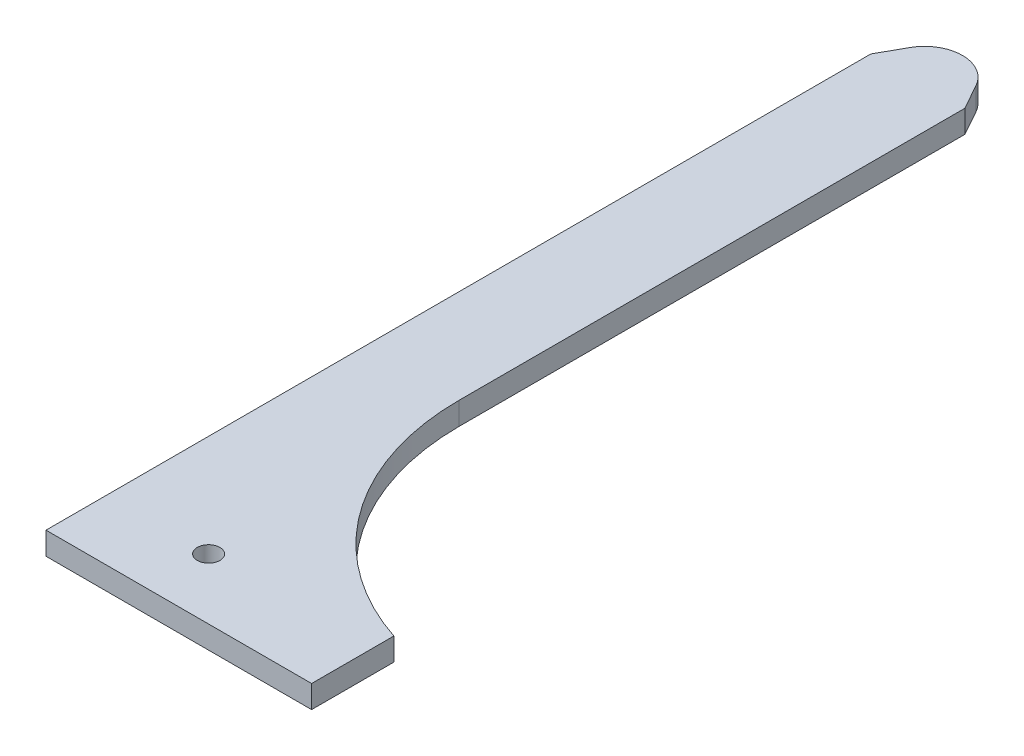
ISO-10303-21;
HEADER;
FILE_DESCRIPTION(('STEP AP214'),'2;1');
FILE_NAME('part.step','',(''),(''),'','','');
FILE_SCHEMA(('AUTOMOTIVE_DESIGN { 1 0 10303 214 1 1 1 1 }'));
ENDSEC;
DATA;
#1=APPLICATION_CONTEXT('core data for automotive mechanical design processes');
#2=APPLICATION_PROTOCOL_DEFINITION('international standard','automotive_design',2000,#1);
#3=PRODUCT_CONTEXT('',#1,'mechanical');
#4=PRODUCT('Part','Part','',(#3));
#5=PRODUCT_RELATED_PRODUCT_CATEGORY('part','',(#4));
#6=PRODUCT_DEFINITION_FORMATION('','',#4);
#7=PRODUCT_DEFINITION_CONTEXT('part definition',#1,'design');
#8=PRODUCT_DEFINITION('design','',#6,#7);
#9=PRODUCT_DEFINITION_SHAPE('','',#8);
#10=(LENGTH_UNIT() NAMED_UNIT(*) SI_UNIT(.MILLI.,.METRE.));
#11=(NAMED_UNIT(*) PLANE_ANGLE_UNIT() SI_UNIT($,.RADIAN.));
#12=(NAMED_UNIT(*) SI_UNIT($,.STERADIAN.) SOLID_ANGLE_UNIT());
#13=UNCERTAINTY_MEASURE_WITH_UNIT(LENGTH_MEASURE(1.E-05),#10,'distance_accuracy_value','');
#14=(GEOMETRIC_REPRESENTATION_CONTEXT(3) GLOBAL_UNCERTAINTY_ASSIGNED_CONTEXT((#13)) GLOBAL_UNIT_ASSIGNED_CONTEXT((#10,
#11,#12)) REPRESENTATION_CONTEXT('',''));
#15=CARTESIAN_POINT('',(0.,0.,0.));
#16=DIRECTION('',(0.,0.,1.));
#17=DIRECTION('',(1.,0.,0.));
#18=AXIS2_PLACEMENT_3D('',#15,#16,#17);
#19=CARTESIAN_POINT('',(-45.46,3.,0.));
#20=DIRECTION('',(-1.,0.,0.));
#21=DIRECTION('',(0.,0.,1.));
#22=AXIS2_PLACEMENT_3D('',#19,#20,#21);
#23=PLANE('',#22);
#24=DIRECTION('',(0.,0.,-1.));
#25=VECTOR('',#24,1.);
#26=CARTESIAN_POINT('',(-45.46,0.,0.));
#27=LINE('',#26,#25);
#28=CARTESIAN_POINT('',(-45.46,0.,42.2620613720887));
#29=VERTEX_POINT('',#28);
#30=CARTESIAN_POINT('',(-45.46,0.,-67.));
#31=VERTEX_POINT('',#30);
#32=EDGE_CURVE('E114',#29,#31,#27,.T.);
#33=ORIENTED_EDGE('',*,*,#32,.F.);
#34=DIRECTION('',(0.,-1.,0.));
#35=VECTOR('',#34,1.);
#36=CARTESIAN_POINT('',(-45.46,3.,42.2620613720887));
#37=LINE('',#36,#35);
#38=CARTESIAN_POINT('',(-45.46,3.,42.2620613720887));
#39=VERTEX_POINT('',#38);
#40=EDGE_CURVE('E109',#39,#29,#37,.T.);
#41=ORIENTED_EDGE('',*,*,#40,.F.);
#42=DIRECTION('',(0.,0.,-1.));
#43=VECTOR('',#42,1.);
#44=CARTESIAN_POINT('',(-45.46,3.,0.));
#45=LINE('',#44,#43);
#46=CARTESIAN_POINT('',(-45.46,3.,-67.));
#47=VERTEX_POINT('',#46);
#48=EDGE_CURVE('E112',#39,#47,#45,.T.);
#49=ORIENTED_EDGE('',*,*,#48,.T.);
#50=DIRECTION('',(0.,-1.,0.));
#51=VECTOR('',#50,1.);
#52=CARTESIAN_POINT('',(-45.46,3.,-67.));
#53=LINE('',#52,#51);
#54=EDGE_CURVE('E159',#47,#31,#53,.T.);
#55=ORIENTED_EDGE('',*,*,#54,.T.);
#56=EDGE_LOOP('',(#33,#41,#49,#55));
#57=FACE_BOUND('',#56,.T.);
#58=ADVANCED_FACE('F45',(#57),#23,.T.);
#59=CARTESIAN_POINT('',(0.,3.,42.2620613720887));
#60=DIRECTION('',(0.,0.,1.));
#61=DIRECTION('',(1.,0.,0.));
#62=AXIS2_PLACEMENT_3D('',#59,#60,#61);
#63=PLANE('',#62);
#64=DIRECTION('',(-1.,0.,0.));
#65=VECTOR('',#64,1.);
#66=CARTESIAN_POINT('',(0.,0.,42.2620613720887));
#67=LINE('',#66,#65);
#68=CARTESIAN_POINT('',(-10.2743008321103,0.,42.2620613720887));
#69=VERTEX_POINT('',#68);
#70=EDGE_CURVE('E162',#69,#29,#67,.T.);
#71=ORIENTED_EDGE('',*,*,#70,.F.);
#72=DIRECTION('',(0.,-1.,0.));
#73=VECTOR('',#72,1.);
#74=CARTESIAN_POINT('',(-10.2743008321103,3.,42.2620613720887));
#75=LINE('',#74,#73);
#76=CARTESIAN_POINT('',(-10.2743008321103,3.,42.2620613720887));
#77=VERTEX_POINT('',#76);
#78=EDGE_CURVE('E121',#77,#69,#75,.T.);
#79=ORIENTED_EDGE('',*,*,#78,.F.);
#80=DIRECTION('',(-1.,0.,0.));
#81=VECTOR('',#80,1.);
#82=CARTESIAN_POINT('',(0.,3.,42.2620613720887));
#83=LINE('',#82,#81);
#84=EDGE_CURVE('E127',#77,#39,#83,.T.);
#85=ORIENTED_EDGE('',*,*,#84,.T.);
#86=ORIENTED_EDGE('',*,*,#40,.T.);
#87=EDGE_LOOP('',(#71,#79,#85,#86));
#88=FACE_BOUND('',#87,.T.);
#89=ADVANCED_FACE('F134',(#88),#63,.T.);
#90=CARTESIAN_POINT('',(-10.2743008321103,3.,0.));
#91=DIRECTION('',(-1.,0.,0.));
#92=DIRECTION('',(0.,0.,1.));
#93=AXIS2_PLACEMENT_3D('',#90,#91,#92);
#94=PLANE('',#93);
#95=DIRECTION('',(0.,0.,-1.));
#96=VECTOR('',#95,1.);
#97=CARTESIAN_POINT('',(-10.2743008321103,0.,0.));
#98=LINE('',#97,#96);
#99=CARTESIAN_POINT('',(-10.2743008321103,0.,31.3598268874574));
#100=VERTEX_POINT('',#99);
#101=EDGE_CURVE('E165',#69,#100,#98,.T.);
#102=ORIENTED_EDGE('',*,*,#101,.T.);
#103=DIRECTION('',(0.,-1.,0.));
#104=VECTOR('',#103,1.);
#105=CARTESIAN_POINT('',(-10.2743008321103,3.,31.3598268874574));
#106=LINE('',#105,#104);
#107=CARTESIAN_POINT('',(-10.2743008321103,3.,31.3598268874574));
#108=VERTEX_POINT('',#107);
#109=EDGE_CURVE('E195',#108,#100,#106,.T.);
#110=ORIENTED_EDGE('',*,*,#109,.F.);
#111=DIRECTION('',(0.,0.,-1.));
#112=VECTOR('',#111,1.);
#113=CARTESIAN_POINT('',(-10.2743008321103,3.,0.));
#114=LINE('',#113,#112);
#115=EDGE_CURVE('E137',#77,#108,#114,.T.);
#116=ORIENTED_EDGE('',*,*,#115,.F.);
#117=ORIENTED_EDGE('',*,*,#78,.T.);
#118=EDGE_LOOP('',(#102,#110,#116,#117));
#119=FACE_BOUND('',#118,.T.);
#120=ADVANCED_FACE('F217',(#119),#94,.F.);
#121=CARTESIAN_POINT('',(0.,3.,0.));
#122=DIRECTION('',(0.,-1.,0.));
#123=DIRECTION('',(0.,0.,-1.));
#124=AXIS2_PLACEMENT_3D('',#121,#122,#123);
#125=CYLINDRICAL_SURFACE('',#124,33.);
#126=CARTESIAN_POINT('',(0.,0.,0.));
#127=DIRECTION('',(0.,1.,0.));
#128=DIRECTION('',(0.,0.,1.));
#129=AXIS2_PLACEMENT_3D('',#126,#127,#128);
#130=CIRCLE('',#129,33.);
#131=CARTESIAN_POINT('',(-33.,0.,0.));
#132=VERTEX_POINT('',#131);
#133=EDGE_CURVE('E169',#132,#100,#130,.T.);
#134=ORIENTED_EDGE('',*,*,#133,.F.);
#135=DIRECTION('',(0.,-1.,0.));
#136=VECTOR('',#135,1.);
#137=CARTESIAN_POINT('',(-33.,3.,0.));
#138=LINE('',#137,#136);
#139=CARTESIAN_POINT('',(-33.,3.,0.));
#140=VERTEX_POINT('',#139);
#141=EDGE_CURVE('E192',#140,#132,#138,.T.);
#142=ORIENTED_EDGE('',*,*,#141,.F.);
#143=CARTESIAN_POINT('',(0.,3.,0.));
#144=DIRECTION('',(0.,1.,0.));
#145=DIRECTION('',(0.,0.,1.));
#146=AXIS2_PLACEMENT_3D('',#143,#144,#145);
#147=CIRCLE('',#146,33.);
#148=EDGE_CURVE('E140',#140,#108,#147,.T.);
#149=ORIENTED_EDGE('',*,*,#148,.T.);
#150=ORIENTED_EDGE('',*,*,#109,.T.);
#151=EDGE_LOOP('',(#134,#142,#149,#150));
#152=FACE_BOUND('',#151,.T.);
#153=ADVANCED_FACE('F222',(#152),#125,.F.);
#154=CARTESIAN_POINT('',(-33.,3.,0.));
#155=DIRECTION('',(-1.,0.,0.));
#156=DIRECTION('',(0.,0.,1.));
#157=AXIS2_PLACEMENT_3D('',#154,#155,#156);
#158=PLANE('',#157);
#159=DIRECTION('',(0.,0.,-1.));
#160=VECTOR('',#159,1.);
#161=CARTESIAN_POINT('',(-33.,0.,0.));
#162=LINE('',#161,#160);
#163=CARTESIAN_POINT('',(-33.,0.,-67.));
#164=VERTEX_POINT('',#163);
#165=EDGE_CURVE('E173',#132,#164,#162,.T.);
#166=ORIENTED_EDGE('',*,*,#165,.T.);
#167=DIRECTION('',(0.,-1.,0.));
#168=VECTOR('',#167,1.);
#169=CARTESIAN_POINT('',(-33.,3.,-67.));
#170=LINE('',#169,#168);
#171=CARTESIAN_POINT('',(-33.,3.,-67.));
#172=VERTEX_POINT('',#171);
#173=EDGE_CURVE('E188',#172,#164,#170,.T.);
#174=ORIENTED_EDGE('',*,*,#173,.F.);
#175=DIRECTION('',(0.,0.,-1.));
#176=VECTOR('',#175,1.);
#177=CARTESIAN_POINT('',(-33.,3.,0.));
#178=LINE('',#177,#176);
#179=EDGE_CURVE('E146',#140,#172,#178,.T.);
#180=ORIENTED_EDGE('',*,*,#179,.F.);
#181=ORIENTED_EDGE('',*,*,#141,.T.);
#182=EDGE_LOOP('',(#166,#174,#180,#181));
#183=FACE_BOUND('',#182,.T.);
#184=ADVANCED_FACE('F224',(#183),#158,.F.);
#185=CARTESIAN_POINT('',(3.29493648525358,3.,-1.83518530695661));
#186=DIRECTION('',(0.873631663831012,0.,-0.486587829638039));
#187=DIRECTION('',(-0.486587829638039,0.,-0.873631663831012));
#188=AXIS2_PLACEMENT_3D('',#185,#186,#187);
#189=PLANE('',#188);
#190=DIRECTION('',(0.486587829638039,0.,0.873631663831012));
#191=VECTOR('',#190,1.);
#192=CARTESIAN_POINT('',(3.29493648525358,0.,-1.83518530695661));
#193=LINE('',#192,#191);
#194=CARTESIAN_POINT('',(-34.861841680845,0.,-70.3427959894444));
#195=VERTEX_POINT('',#194);
#196=EDGE_CURVE('E177',#195,#164,#193,.T.);
#197=ORIENTED_EDGE('',*,*,#196,.F.);
#198=DIRECTION('',(0.,-1.,0.));
#199=VECTOR('',#198,1.);
#200=CARTESIAN_POINT('',(-34.8618416808449,3.,-70.3427959894444));
#201=LINE('',#200,#199);
#202=CARTESIAN_POINT('',(-34.861841680845,3.,-70.3427959894444));
#203=VERTEX_POINT('',#202);
#204=EDGE_CURVE('E54',#195,#203,#201,.F.);
#205=ORIENTED_EDGE('',*,*,#204,.T.);
#206=DIRECTION('',(0.486587829638039,0.,0.873631663831012));
#207=VECTOR('',#206,1.);
#208=CARTESIAN_POINT('',(3.29493648525358,3.,-1.83518530695661));
#209=LINE('',#208,#207);
#210=EDGE_CURVE('E150',#203,#172,#209,.T.);
#211=ORIENTED_EDGE('',*,*,#210,.T.);
#212=ORIENTED_EDGE('',*,*,#173,.T.);
#213=EDGE_LOOP('',(#197,#205,#211,#212));
#214=FACE_BOUND('',#213,.T.);
#215=ADVANCED_FACE('F225',(#214),#189,.T.);
#216=CARTESIAN_POINT('',(-63.1781414916708,3.,-35.1884163792665));
#217=DIRECTION('',(0.873631663831012,0.,0.486587829638039));
#218=DIRECTION('',(0.486587829638039,0.,-0.873631663831012));
#219=AXIS2_PLACEMENT_3D('',#216,#217,#218);
#220=PLANE('',#219);
#221=DIRECTION('',(-0.486587829638039,0.,0.873631663831012));
#222=VECTOR('',#221,1.);
#223=CARTESIAN_POINT('',(-63.1781414916708,3.,-35.1884163792665));
#224=LINE('',#223,#222);
#225=CARTESIAN_POINT('',(-43.5981583191551,3.,-70.3427959894444));
#226=VERTEX_POINT('',#225);
#227=EDGE_CURVE('E129',#226,#47,#224,.T.);
#228=ORIENTED_EDGE('',*,*,#227,.F.);
#229=DIRECTION('',(0.,-1.,0.));
#230=VECTOR('',#229,1.);
#231=CARTESIAN_POINT('',(-43.5981583191551,0.,-70.3427959894444));
#232=LINE('',#231,#230);
#233=CARTESIAN_POINT('',(-43.5981583191551,0.,-70.3427959894444));
#234=VERTEX_POINT('',#233);
#235=EDGE_CURVE('E120',#226,#234,#232,.T.);
#236=ORIENTED_EDGE('',*,*,#235,.T.);
#237=DIRECTION('',(-0.486587829638039,0.,0.873631663831012));
#238=VECTOR('',#237,1.);
#239=CARTESIAN_POINT('',(-63.1781414916708,0.,-35.1884163792665));
#240=LINE('',#239,#238);
#241=EDGE_CURVE('E180',#234,#31,#240,.T.);
#242=ORIENTED_EDGE('',*,*,#241,.T.);
#243=ORIENTED_EDGE('',*,*,#54,.F.);
#244=EDGE_LOOP('',(#228,#236,#242,#243));
#245=FACE_BOUND('',#244,.T.);
#246=ADVANCED_FACE('F207',(#245),#220,.F.);
#247=CARTESIAN_POINT('',(-31.96,3.,34.2220613720887));
#248=DIRECTION('',(0.,-1.,0.));
#249=DIRECTION('',(0.,0.,-1.));
#250=AXIS2_PLACEMENT_3D('',#247,#248,#249);
#251=CYLINDRICAL_SURFACE('',#250,1.5);
#252=CARTESIAN_POINT('',(-31.96,3.,34.2220613720887));
#253=DIRECTION('',(0.,1.,0.));
#254=DIRECTION('',(0.,0.,1.));
#255=AXIS2_PLACEMENT_3D('',#252,#253,#254);
#256=CIRCLE('',#255,1.5);
#257=CARTESIAN_POINT('',(-31.96,3.,35.7220613720887));
#258=VERTEX_POINT('',#257);
#259=EDGE_CURVE('E155',#258,#258,#256,.T.);
#260=ORIENTED_EDGE('',*,*,#259,.T.);
#261=EDGE_LOOP('',(#260));
#262=FACE_BOUND('',#261,.T.);
#263=CARTESIAN_POINT('',(-31.96,0.,34.2220613720887));
#264=DIRECTION('',(0.,1.,0.));
#265=DIRECTION('',(0.,0.,1.));
#266=AXIS2_PLACEMENT_3D('',#263,#264,#265);
#267=CIRCLE('',#266,1.5);
#268=CARTESIAN_POINT('',(-31.96,0.,35.7220613720887));
#269=VERTEX_POINT('',#268);
#270=EDGE_CURVE('E132',#269,#269,#267,.T.);
#271=ORIENTED_EDGE('',*,*,#270,.F.);
#272=EDGE_LOOP('',(#271));
#273=FACE_BOUND('',#272,.T.);
#274=ADVANCED_FACE('F247',(#262,#273),#251,.F.);
#275=CARTESIAN_POINT('',(0.,3.,0.));
#276=DIRECTION('',(0.,1.,0.));
#277=DIRECTION('',(0.,0.,1.));
#278=AXIS2_PLACEMENT_3D('',#275,#276,#277);
#279=PLANE('',#278);
#280=ORIENTED_EDGE('',*,*,#210,.F.);
#281=CARTESIAN_POINT('',(-39.23,3.,-67.9098568412542));
#282=DIRECTION('',(0.,1.,0.));
#283=DIRECTION('',(0.,0.,1.));
#284=AXIS2_PLACEMENT_3D('',#281,#282,#283);
#285=CIRCLE('',#284,5.);
#286=EDGE_CURVE('E11',#203,#226,#285,.T.);
#287=ORIENTED_EDGE('',*,*,#286,.T.);
#288=ORIENTED_EDGE('',*,*,#227,.T.);
#289=ORIENTED_EDGE('',*,*,#48,.F.);
#290=ORIENTED_EDGE('',*,*,#84,.F.);
#291=ORIENTED_EDGE('',*,*,#115,.T.);
#292=ORIENTED_EDGE('',*,*,#148,.F.);
#293=ORIENTED_EDGE('',*,*,#179,.T.);
#294=EDGE_LOOP('',(#280,#287,#288,#289,#290,#291,#292,#293));
#295=FACE_BOUND('',#294,.T.);
#296=ORIENTED_EDGE('',*,*,#259,.F.);
#297=EDGE_LOOP('',(#296));
#298=FACE_BOUND('',#297,.T.);
#299=ADVANCED_FACE('F125',(#295,#298),#279,.T.);
#300=CARTESIAN_POINT('',(0.,0.,0.));
#301=DIRECTION('',(0.,1.,0.));
#302=DIRECTION('',(0.,0.,1.));
#303=AXIS2_PLACEMENT_3D('',#300,#301,#302);
#304=PLANE('',#303);
#305=ORIENTED_EDGE('',*,*,#241,.F.);
#306=CARTESIAN_POINT('',(-39.23,0.,-67.9098568412542));
#307=DIRECTION('',(0.,1.,0.));
#308=DIRECTION('',(0.,0.,1.));
#309=AXIS2_PLACEMENT_3D('',#306,#307,#308);
#310=CIRCLE('',#309,5.);
#311=EDGE_CURVE('E68',#234,#195,#310,.F.);
#312=ORIENTED_EDGE('',*,*,#311,.T.);
#313=ORIENTED_EDGE('',*,*,#196,.T.);
#314=ORIENTED_EDGE('',*,*,#165,.F.);
#315=ORIENTED_EDGE('',*,*,#133,.T.);
#316=ORIENTED_EDGE('',*,*,#101,.F.);
#317=ORIENTED_EDGE('',*,*,#70,.T.);
#318=ORIENTED_EDGE('',*,*,#32,.T.);
#319=EDGE_LOOP('',(#305,#312,#313,#314,#315,#316,#317,#318));
#320=FACE_BOUND('',#319,.T.);
#321=ORIENTED_EDGE('',*,*,#270,.T.);
#322=EDGE_LOOP('',(#321));
#323=FACE_BOUND('',#322,.T.);
#324=ADVANCED_FACE('F210',(#320,#323),#304,.F.);
#325=CARTESIAN_POINT('',(-39.23,3.,-67.9098568412542));
#326=DIRECTION('',(0.,1.,0.));
#327=DIRECTION('',(0.,0.,1.));
#328=AXIS2_PLACEMENT_3D('',#325,#326,#327);
#329=CYLINDRICAL_SURFACE('',#328,5.);
#330=ORIENTED_EDGE('',*,*,#286,.F.);
#331=ORIENTED_EDGE('',*,*,#204,.F.);
#332=ORIENTED_EDGE('',*,*,#311,.F.);
#333=ORIENTED_EDGE('',*,*,#235,.F.);
#334=EDGE_LOOP('',(#330,#331,#332,#333));
#335=FACE_BOUND('',#334,.T.);
#336=ADVANCED_FACE('F47',(#335),#329,.T.);
#337=CLOSED_SHELL('',(#58,#89,#120,#153,#184,#215,#246,#274,#299,#324,#336));
#338=MANIFOLD_SOLID_BREP('B2',#337);
#339=ADVANCED_BREP_SHAPE_REPRESENTATION('',(#18,#338),#14);
#340=SHAPE_DEFINITION_REPRESENTATION(#9,#339);
ENDSEC;
END-ISO-10303-21;
